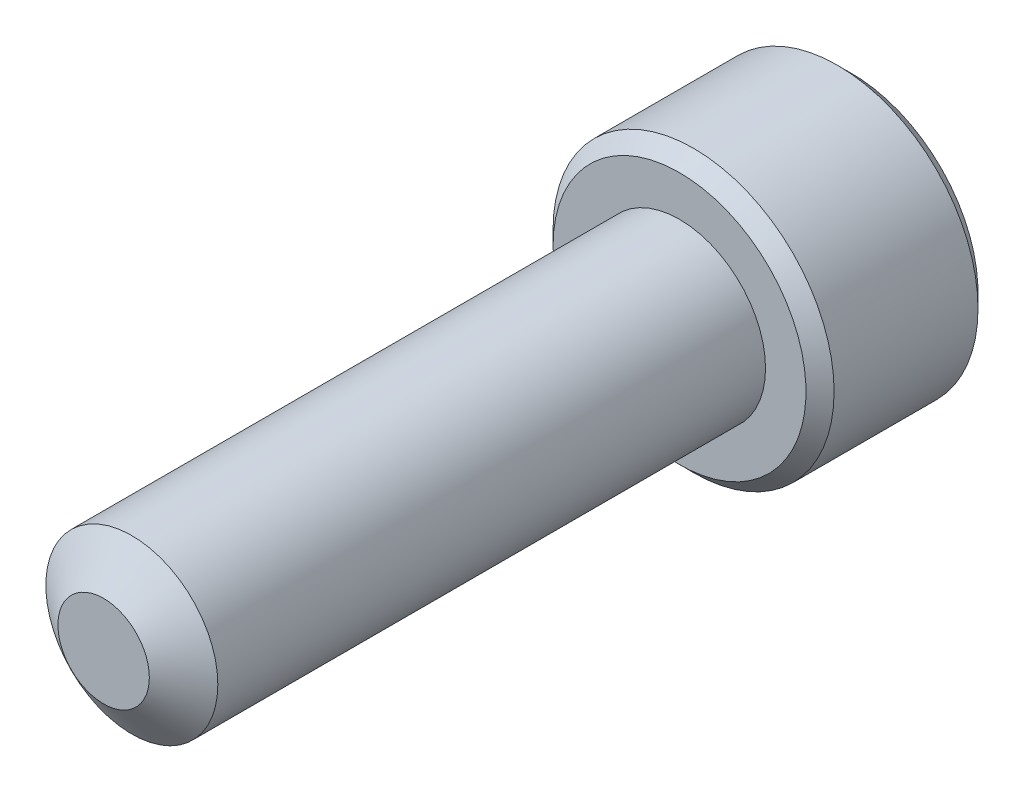
ISO-10303-21;
HEADER;
FILE_DESCRIPTION(('STEP AP214'),'2;1');
FILE_NAME('part.step','',(''),(''),'','','');
FILE_SCHEMA(('AUTOMOTIVE_DESIGN { 1 0 10303 214 1 1 1 1 }'));
ENDSEC;
DATA;
#1=APPLICATION_CONTEXT('core data for automotive mechanical design processes');
#2=APPLICATION_PROTOCOL_DEFINITION('international standard','automotive_design',2000,#1);
#3=PRODUCT_CONTEXT('',#1,'mechanical');
#4=PRODUCT('Part','Part','',(#3));
#5=PRODUCT_RELATED_PRODUCT_CATEGORY('part','',(#4));
#6=PRODUCT_DEFINITION_FORMATION('','',#4);
#7=PRODUCT_DEFINITION_CONTEXT('part definition',#1,'design');
#8=PRODUCT_DEFINITION('design','',#6,#7);
#9=PRODUCT_DEFINITION_SHAPE('','',#8);
#10=(LENGTH_UNIT() NAMED_UNIT(*) SI_UNIT(.MILLI.,.METRE.));
#11=(NAMED_UNIT(*) PLANE_ANGLE_UNIT() SI_UNIT($,.RADIAN.));
#12=(NAMED_UNIT(*) SI_UNIT($,.STERADIAN.) SOLID_ANGLE_UNIT());
#13=UNCERTAINTY_MEASURE_WITH_UNIT(LENGTH_MEASURE(1.E-05),#10,'distance_accuracy_value','');
#14=(GEOMETRIC_REPRESENTATION_CONTEXT(3) GLOBAL_UNCERTAINTY_ASSIGNED_CONTEXT((#13)) GLOBAL_UNIT_ASSIGNED_CONTEXT((#10,
#11,#12)) REPRESENTATION_CONTEXT('',''));
#15=CARTESIAN_POINT('',(0.,0.,0.));
#16=DIRECTION('',(0.,0.,1.));
#17=DIRECTION('',(1.,0.,0.));
#18=AXIS2_PLACEMENT_3D('',#15,#16,#17);
#19=CARTESIAN_POINT('',(0.,0.,-9.52499999999981));
#20=DIRECTION('',(0.,0.,1.));
#21=DIRECTION('',(1.,0.,0.));
#22=AXIS2_PLACEMENT_3D('',#19,#20,#21);
#23=CYLINDRICAL_SURFACE('',#22,1.4224);
#24=CARTESIAN_POINT('',(0.,0.,-9.52499999999981));
#25=DIRECTION('',(0.,0.,-1.));
#26=DIRECTION('',(-1.,0.,0.));
#27=AXIS2_PLACEMENT_3D('',#24,#25,#26);
#28=CIRCLE('',#27,1.4224);
#29=CARTESIAN_POINT('',(-1.42239999999996,0.,-9.52499999999982));
#30=VERTEX_POINT('',#29);
#31=EDGE_CURVE('E215',#30,#30,#28,.F.);
#32=ORIENTED_EDGE('',*,*,#31,.T.);
#33=EDGE_LOOP('',(#32));
#34=FACE_BOUND('',#33,.T.);
#35=CARTESIAN_POINT('',(0.,0.,-0.466649531705332));
#36=DIRECTION('',(0.,0.,1.));
#37=DIRECTION('',(1.,0.,0.));
#38=AXIS2_PLACEMENT_3D('',#35,#36,#37);
#39=CIRCLE('',#38,1.4224);
#40=CARTESIAN_POINT('',(1.4224,0.,-0.466649531705329));
#41=VERTEX_POINT('',#40);
#42=EDGE_CURVE('E112',#41,#41,#39,.T.);
#43=ORIENTED_EDGE('',*,*,#42,.F.);
#44=EDGE_LOOP('',(#43));
#45=FACE_BOUND('',#44,.T.);
#46=ADVANCED_FACE('F38',(#34,#45),#23,.T.);
#47=CARTESIAN_POINT('',(0.,0.,0.));
#48=DIRECTION('',(0.,0.,-1.));
#49=DIRECTION('',(-1.,0.,0.));
#50=AXIS2_PLACEMENT_3D('',#47,#48,#49);
#51=CONICAL_SURFACE('',#50,0.755955401447659,0.959931088596884);
#52=ORIENTED_EDGE('',*,*,#42,.T.);
#53=EDGE_LOOP('',(#52));
#54=FACE_BOUND('',#53,.T.);
#55=CARTESIAN_POINT('',(0.,0.,0.));
#56=DIRECTION('',(0.,0.,1.));
#57=DIRECTION('',(1.,0.,0.));
#58=AXIS2_PLACEMENT_3D('',#55,#56,#57);
#59=CIRCLE('',#58,0.755955401447659);
#60=CARTESIAN_POINT('',(0.755955401447661,0.,0.));
#61=VERTEX_POINT('',#60);
#62=EDGE_CURVE('E213',#61,#61,#59,.T.);
#63=ORIENTED_EDGE('',*,*,#62,.F.);
#64=EDGE_LOOP('',(#63));
#65=FACE_BOUND('',#64,.T.);
#66=ADVANCED_FACE('F196',(#54,#65),#51,.T.);
#67=CARTESIAN_POINT('',(0.,0.,0.));
#68=DIRECTION('',(0.,0.,1.));
#69=DIRECTION('',(1.,0.,0.));
#70=AXIS2_PLACEMENT_3D('',#67,#68,#69);
#71=PLANE('',#70);
#72=ORIENTED_EDGE('',*,*,#62,.T.);
#73=EDGE_LOOP('',(#72));
#74=FACE_BOUND('',#73,.T.);
#75=ADVANCED_FACE('F193',(#74),#71,.T.);
#76=CARTESIAN_POINT('',(0.,0.,-12.3697999999998));
#77=DIRECTION('',(0.,0.,1.));
#78=DIRECTION('',(1.,0.,0.));
#79=AXIS2_PLACEMENT_3D('',#76,#77,#78);
#80=CYLINDRICAL_SURFACE('',#79,2.3241);
#81=CARTESIAN_POINT('',(0.,1.00613961606655E-13,-12.1373899999998));
#82=DIRECTION('',(0.,0.,-1.));
#83=DIRECTION('',(-1.,0.,0.));
#84=AXIS2_PLACEMENT_3D('',#81,#82,#83);
#85=CIRCLE('',#84,2.3241);
#86=CARTESIAN_POINT('',(-2.32410000000002,1.01710576072556E-13,-12.1373899999998));
#87=VERTEX_POINT('',#86);
#88=EDGE_CURVE('E46',#87,#87,#85,.F.);
#89=ORIENTED_EDGE('',*,*,#88,.T.);
#90=EDGE_LOOP('',(#89));
#91=FACE_BOUND('',#90,.T.);
#92=CARTESIAN_POINT('',(0.,0.,-9.75740999999985));
#93=DIRECTION('',(0.,0.,-1.));
#94=DIRECTION('',(-1.,0.,0.));
#95=AXIS2_PLACEMENT_3D('',#92,#93,#94);
#96=CIRCLE('',#95,2.3241);
#97=CARTESIAN_POINT('',(-2.32409999999998,0.,-9.75740999999986));
#98=VERTEX_POINT('',#97);
#99=EDGE_CURVE('E172',#98,#98,#96,.T.);
#100=ORIENTED_EDGE('',*,*,#99,.T.);
#101=EDGE_LOOP('',(#100));
#102=FACE_BOUND('',#101,.T.);
#103=ADVANCED_FACE('F177',(#91,#102),#80,.T.);
#104=CARTESIAN_POINT('',(0.,0.,-12.3697999999998));
#105=DIRECTION('',(0.,0.,-1.));
#106=DIRECTION('',(-1.,0.,0.));
#107=AXIS2_PLACEMENT_3D('',#104,#105,#106);
#108=PLANE('',#107);
#109=CARTESIAN_POINT('',(0.,0.,-12.3697999999998));
#110=DIRECTION('',(0.,0.,-1.));
#111=DIRECTION('',(-1.,0.,0.));
#112=AXIS2_PLACEMENT_3D('',#109,#110,#111);
#113=CIRCLE('',#112,2.09169);
#114=CARTESIAN_POINT('',(-2.09168999999995,0.,-12.3697999999998));
#115=VERTEX_POINT('',#114);
#116=EDGE_CURVE('E111',#115,#115,#113,.T.);
#117=ORIENTED_EDGE('',*,*,#116,.T.);
#118=EDGE_LOOP('',(#117));
#119=FACE_BOUND('',#118,.T.);
#120=CARTESIAN_POINT('',(0.,0.,-12.3697999999998));
#121=DIRECTION('',(0.,0.,-1.));
#122=DIRECTION('',(-1.,0.,0.));
#123=AXIS2_PLACEMENT_3D('',#120,#121,#122);
#124=CIRCLE('',#123,1.3748153285078);
#125=CARTESIAN_POINT('',(-1.19062500000001,0.687407664253941,-12.3697999999998));
#126=VERTEX_POINT('',#125);
#127=CARTESIAN_POINT('',(0.,1.37481532850783,-12.3697999999998));
#128=VERTEX_POINT('',#127);
#129=EDGE_CURVE('E92',#126,#128,#124,.T.);
#130=ORIENTED_EDGE('',*,*,#129,.F.);
#131=CARTESIAN_POINT('',(-1.19062500000002,-0.687407664253851,-12.3697999999998));
#132=VERTEX_POINT('',#131);
#133=EDGE_CURVE('E52',#132,#126,#124,.T.);
#134=ORIENTED_EDGE('',*,*,#133,.F.);
#135=CARTESIAN_POINT('',(0.,-1.37481532850773,-12.3697999999998));
#136=VERTEX_POINT('',#135);
#137=EDGE_CURVE('E271',#136,#132,#124,.T.);
#138=ORIENTED_EDGE('',*,*,#137,.F.);
#139=CARTESIAN_POINT('',(1.19062499999993,-0.687407664253795,-12.3697999999999));
#140=VERTEX_POINT('',#139);
#141=EDGE_CURVE('E59',#140,#136,#124,.T.);
#142=ORIENTED_EDGE('',*,*,#141,.F.);
#143=CARTESIAN_POINT('',(1.19062499999994,0.687407664253983,-12.3697999999998));
#144=VERTEX_POINT('',#143);
#145=EDGE_CURVE('E133',#144,#140,#124,.T.);
#146=ORIENTED_EDGE('',*,*,#145,.F.);
#147=EDGE_CURVE('E101',#128,#144,#124,.T.);
#148=ORIENTED_EDGE('',*,*,#147,.F.);
#149=EDGE_LOOP('',(#130,#134,#138,#142,#146,#148));
#150=FACE_BOUND('',#149,.T.);
#151=ADVANCED_FACE('F132',(#119,#150),#108,.T.);
#152=CARTESIAN_POINT('',(0.,0.,-9.52499999999981));
#153=DIRECTION('',(0.,0.,-1.));
#154=DIRECTION('',(-1.,0.,0.));
#155=AXIS2_PLACEMENT_3D('',#152,#153,#154);
#156=PLANE('',#155);
#157=CARTESIAN_POINT('',(0.,0.,-9.52499999999981));
#158=DIRECTION('',(0.,0.,-1.));
#159=DIRECTION('',(-1.,0.,0.));
#160=AXIS2_PLACEMENT_3D('',#157,#158,#159);
#161=CIRCLE('',#160,2.09169);
#162=CARTESIAN_POINT('',(-2.09168999999996,0.,-9.52499999999982));
#163=VERTEX_POINT('',#162);
#164=EDGE_CURVE('E11',#163,#163,#161,.F.);
#165=ORIENTED_EDGE('',*,*,#164,.T.);
#166=EDGE_LOOP('',(#165));
#167=FACE_BOUND('',#166,.T.);
#168=ORIENTED_EDGE('',*,*,#31,.F.);
#169=EDGE_LOOP('',(#168));
#170=FACE_BOUND('',#169,.T.);
#171=ADVANCED_FACE('F186',(#167,#170),#156,.F.);
#172=CARTESIAN_POINT('',(0.,0.,-12.3697999999998));
#173=DIRECTION('',(0.,0.,-1.));
#174=DIRECTION('',(-1.,0.,0.));
#175=AXIS2_PLACEMENT_3D('',#172,#173,#174);
#176=CONICAL_SURFACE('',#175,1.3748153285078,0.78539816339745);
#177=ORIENTED_EDGE('',*,*,#147,.T.);
#178=CARTESIAN_POINT('',(-0.000199999999967587,1.3749307985617,-12.3699154845999));
#179=CARTESIAN_POINT('',(0.0407344195898851,1.3512973003924,-12.3462987642141));
#180=CARTESIAN_POINT('',(0.0823533883019986,1.32726857760308,-12.324068781723));
#181=CARTESIAN_POINT('',(0.167219443673659,1.27827113768919,-12.2833656626273));
#182=CARTESIAN_POINT('',(0.210474607290993,1.25329775733088,-12.2649151826474));
#183=CARTESIAN_POINT('',(0.297696647457468,1.2029400889615,-12.2333088380042));
#184=CARTESIAN_POINT('',(0.341641294957975,1.17756863489764,-12.2200735042432));
#185=CARTESIAN_POINT('',(0.430498374163732,1.12626697629878,-12.1996814515752));
#186=CARTESIAN_POINT('',(0.475408088834776,1.10033834044421,-12.1925095028957));
#187=CARTESIAN_POINT('',(0.552804127656995,1.055653716596,-12.1860385386486));
#188=CARTESIAN_POINT('',(0.585190412515669,1.0369554863148,-12.1850803201466));
#189=CARTESIAN_POINT('',(0.649906073317797,0.999591882129916,-12.1866926490719));
#190=CARTESIAN_POINT('',(0.6822354351273,0.980926516386467,-12.1892639751794));
#191=CARTESIAN_POINT('',(0.746582156071515,0.943775919727857,-12.1977867539934));
#192=CARTESIAN_POINT('',(0.778599196336801,0.925290872912045,-12.2037413547524));
#193=CARTESIAN_POINT('',(0.84209876339649,0.888629380776694,-12.218709964071));
#194=CARTESIAN_POINT('',(0.873581054644194,0.870453071450105,-12.2277252859118));
#195=CARTESIAN_POINT('',(0.954214838572157,0.823899134593503,-12.2544822958378));
#196=CARTESIAN_POINT('',(1.0028578352677,0.795815087357172,-12.2742368144358));
#197=CARTESIAN_POINT('',(1.09823941635216,0.740746505842354,-12.3187367689575));
#198=CARTESIAN_POINT('',(1.14498361758718,0.713758728676255,-12.343465964716));
#199=CARTESIAN_POINT('',(1.19082499999999,0.687292194200124,-12.3699154845999));
#200=B_SPLINE_CURVE_WITH_KNOTS('',3,(#178,#179,#180,#181,#182,#183,#184,#185,#186,#187,#188,
#189,#190,#191,#192,#193,#194,#195,#196,#197,#198,#199),.UNSPECIFIED.,.F.,.F.,(4,2,2,2,2,2,2,2,
2,2,4),(0.,0.158625672934115,0.31817607984329,0.475191357500681,0.631811068630764,
0.743878551794729,0.855970763007046,0.968167444423263,1.08041232768379,1.2587335164547,
1.4364817447985),.UNSPECIFIED.);
#201=EDGE_CURVE('E106',#128,#144,#200,.T.);
#202=ORIENTED_EDGE('',*,*,#201,.F.);
#203=EDGE_LOOP('',(#177,#202));
#204=FACE_BOUND('',#203,.T.);
#205=ADVANCED_FACE('F107',(#204),#176,.F.);
#206=ORIENTED_EDGE('',*,*,#145,.T.);
#207=CARTESIAN_POINT('',(1.19062500000002,-1.3709714529469,-12.8107904472898));
#208=CARTESIAN_POINT('',(1.19062500000002,-1.33758920637889,-12.7855899888077));
#209=CARTESIAN_POINT('',(1.19062500000002,-1.30402095496658,-12.7606366202373));
#210=CARTESIAN_POINT('',(1.19062500000002,-1.23643692297762,-12.711326087177));
#211=CARTESIAN_POINT('',(1.19062500000002,-1.20242103219112,-12.6869690738992));
#212=CARTESIAN_POINT('',(1.19062500000002,-1.09909081482553,-12.614598208989));
#213=CARTESIAN_POINT('',(1.19062500000001,-1.02900143506765,-12.5676726225954));
#214=CARTESIAN_POINT('',(1.19062500000002,-0.882026737424197,-12.4755521033254));
#215=CARTESIAN_POINT('',(1.19062500000003,-0.804981866019942,-12.4306088372418));
#216=CARTESIAN_POINT('',(1.190625,-0.647043893307907,-12.3483980245066));
#217=CARTESIAN_POINT('',(1.19062499999995,-0.56616494370285,-12.3111046017319));
#218=CARTESIAN_POINT('',(1.19062499999998,-0.444764933868778,-12.2654795555629));
#219=CARTESIAN_POINT('',(1.19062500000001,-0.406041211486637,-12.2523848390212));
#220=CARTESIAN_POINT('',(1.19062500000003,-0.327658904711858,-12.2293042758964));
#221=CARTESIAN_POINT('',(1.19062500000002,-0.288000256118176,-12.2193186434857));
#222=CARTESIAN_POINT('',(1.19062500000001,-0.208647693212021,-12.203141229065));
#223=CARTESIAN_POINT('',(1.19062500000002,-0.168967240621886,-12.1968844458487));
#224=CARTESIAN_POINT('',(1.19062500000002,-0.0891819742964573,-12.1882868884183));
#225=CARTESIAN_POINT('',(1.19062500000001,-0.0490772347012353,-12.1859454410497));
#226=CARTESIAN_POINT('',(1.19062500000001,0.0297075773932525,-12.1853522440674));
#227=CARTESIAN_POINT('',(1.19062500000002,0.0683866068288826,-12.1869553537958));
#228=CARTESIAN_POINT('',(1.19062500000002,0.145416876633219,-12.1938430277443));
#229=CARTESIAN_POINT('',(1.19062500000001,0.183768052740744,-12.1991282976682));
#230=CARTESIAN_POINT('',(1.19062500000002,0.260508634905004,-12.2131814122326));
#231=CARTESIAN_POINT('',(1.19062500000002,0.298887052039189,-12.2220083626056));
#232=CARTESIAN_POINT('',(1.19062500000001,0.374805334250713,-12.2426757099804));
#233=CARTESIAN_POINT('',(1.19062499999999,0.412345269207138,-12.2545158548357));
#234=CARTESIAN_POINT('',(1.19062499999996,0.530535580908892,-12.296247333667));
#235=CARTESIAN_POINT('',(1.190625,0.609503725744518,-12.3308913969141));
#236=CARTESIAN_POINT('',(1.19062500000003,0.763730269113565,-12.4079182519746));
#237=CARTESIAN_POINT('',(1.19062500000002,0.838974064674713,-12.4503288466685));
#238=CARTESIAN_POINT('',(1.19062500000001,0.982775796189741,-12.5378256450248));
#239=CARTESIAN_POINT('',(1.19062500000002,1.05148016607057,-12.5826741620551));
#240=CARTESIAN_POINT('',(1.19062500000002,1.15270222256268,-12.6520053299224));
#241=CARTESIAN_POINT('',(1.19062500000002,1.18600604145849,-12.675360176337));
#242=CARTESIAN_POINT('',(1.19062500000002,1.25215860362247,-12.7226875690192));
#243=CARTESIAN_POINT('',(1.19062500000001,1.28500746868294,-12.7466599448581));
#244=CARTESIAN_POINT('',(1.19062500000001,1.31766689427988,-12.7708883667711));
#245=B_SPLINE_CURVE_WITH_KNOTS('',3,(#207,#208,#209,#210,#211,#212,#213,#214,#215,#216,#217,
#218,#219,#220,#221,#222,#223,#224,#225,#226,#227,#228,#229,#230,#231,#232,#233,#234,#235,#236,
#237,#238,#239,#240,#241,#242,#243,#244),.UNSPECIFIED.,.F.,.F.,(4,2,2,2,2,2,2,2,2,2,2,2,2,2,2,2,
2,2,4),(0.,0.125475644763345,0.250982782413998,0.50391251876923,0.771279184643307,
1.03772598255668,1.16025581644641,1.28279408906677,1.40312855503258,1.52344233005041,
1.63939577664887,1.75537145240487,1.87336894094847,1.99135655861161,2.24929724983461,
2.50818004711579,2.75419821472216,2.87622362118618,2.99821570388985),.UNSPECIFIED.);
#246=EDGE_CURVE('E100',#144,#140,#245,.F.);
#247=ORIENTED_EDGE('',*,*,#246,.F.);
#248=EDGE_LOOP('',(#206,#247));
#249=FACE_BOUND('',#248,.T.);
#250=ADVANCED_FACE('F277',(#249),#176,.F.);
#251=ORIENTED_EDGE('',*,*,#141,.T.);
#252=CARTESIAN_POINT('',(1.19082500000002,-0.687292194200075,-12.3699154845999));
#253=CARTESIAN_POINT('',(1.14989058041017,-0.710925692369388,-12.3462987642141));
#254=CARTESIAN_POINT('',(1.10827161169805,-0.734954415158717,-12.3240687817229));
#255=CARTESIAN_POINT('',(1.02340555632639,-0.783951855072601,-12.2833656626272));
#256=CARTESIAN_POINT('',(0.980150392709058,-0.808925235430908,-12.2649151826474));
#257=CARTESIAN_POINT('',(0.892928352542597,-0.859282903800289,-12.2333088380041));
#258=CARTESIAN_POINT('',(0.848983705042101,-0.88465435786415,-12.2200735042431));
#259=CARTESIAN_POINT('',(0.760126625836331,-0.935956016462986,-12.1996814515752));
#260=CARTESIAN_POINT('',(0.715216911165263,-0.96188465231753,-12.1925095028958));
#261=CARTESIAN_POINT('',(0.637820872343051,-1.00656927616575,-12.1860385386487));
#262=CARTESIAN_POINT('',(0.605434587484394,-1.02526750644697,-12.1850803201466));
#263=CARTESIAN_POINT('',(0.540718926682282,-1.06263111063187,-12.1866926490719));
#264=CARTESIAN_POINT('',(0.508389564872778,-1.08129647637531,-12.1892639751794));
#265=CARTESIAN_POINT('',(0.444042843928573,-1.11844707303392,-12.1977867539934));
#266=CARTESIAN_POINT('',(0.412025803663297,-1.13693211984974,-12.2037413547524));
#267=CARTESIAN_POINT('',(0.348526236603599,-1.17359361198505,-12.218709964071));
#268=CARTESIAN_POINT('',(0.317043945355875,-1.19176992131159,-12.2277252859119));
#269=CARTESIAN_POINT('',(0.236410161427891,-1.23832385816815,-12.2544822958379));
#270=CARTESIAN_POINT('',(0.187767164732376,-1.26640790540456,-12.2742368144358));
#271=CARTESIAN_POINT('',(0.0923855836479209,-1.32147648691947,-12.3187367689575));
#272=CARTESIAN_POINT('',(0.0456413824128745,-1.34846426408558,-12.343465964716));
#273=CARTESIAN_POINT('',(-0.000200000000040446,-1.37493079856156,-12.3699154845999));
#274=B_SPLINE_CURVE_WITH_KNOTS('',3,(#252,#253,#254,#255,#256,#257,#258,#259,#260,#261,#262,
#263,#264,#265,#266,#267,#268,#269,#270,#271,#272,#273),.UNSPECIFIED.,.F.,.F.,(4,2,2,2,2,2,2,2,
2,2,4),(0.,0.158625672934123,0.318176079843278,0.475191357500652,0.631811068630733,
0.743878551794691,0.855970763006993,0.968167444423198,1.08041232768372,1.25873351645465,
1.43648174479848),.UNSPECIFIED.);
#275=EDGE_CURVE('E142',#140,#136,#274,.T.);
#276=ORIENTED_EDGE('',*,*,#275,.F.);
#277=EDGE_LOOP('',(#251,#276));
#278=FACE_BOUND('',#277,.T.);
#279=ADVANCED_FACE('F274',(#278),#176,.F.);
#280=ORIENTED_EDGE('',*,*,#137,.T.);
#281=CARTESIAN_POINT('',(0.000200000000033507,-1.37493079856163,-12.3699154845998));
#282=CARTESIAN_POINT('',(-0.0407344195898303,-1.35129730039227,-12.346298764214));
#283=CARTESIAN_POINT('',(-0.0823533883019515,-1.32726857760292,-12.3240687817229));
#284=CARTESIAN_POINT('',(-0.167219443673612,-1.27827113768902,-12.2833656626272));
#285=CARTESIAN_POINT('',(-0.210474607290939,-1.25329775733072,-12.2649151826474));
#286=CARTESIAN_POINT('',(-0.297696647457401,-1.20294008896135,-12.2333088380041));
#287=CARTESIAN_POINT('',(-0.341641294957902,-1.1775686348975,-12.2200735042431));
#288=CARTESIAN_POINT('',(-0.430498374163666,-1.12626697629863,-12.1996814515752));
#289=CARTESIAN_POINT('',(-0.475408088834722,-1.10033834044405,-12.1925095028958));
#290=CARTESIAN_POINT('',(-0.552804127656953,-1.05565371659583,-12.1860385386487));
#291=CARTESIAN_POINT('',(-0.58519041251563,-1.03695548631463,-12.1850803201466));
#292=CARTESIAN_POINT('',(-0.649906073317762,-0.999591882129751,-12.1866926490719));
#293=CARTESIAN_POINT('',(-0.682235435127264,-0.980926516386304,-12.1892639751794));
#294=CARTESIAN_POINT('',(-0.746582156071478,-0.943775919727684,-12.1977867539934));
#295=CARTESIAN_POINT('',(-0.778599196336762,-0.925290872911859,-12.2037413547524));
#296=CARTESIAN_POINT('',(-0.84209876339646,-0.888629380776543,-12.218709964071));
#297=CARTESIAN_POINT('',(-0.873581054644176,-0.870453071450002,-12.2277252859119));
#298=CARTESIAN_POINT('',(-0.954214838572143,-0.823899134593437,-12.2544822958379));
#299=CARTESIAN_POINT('',(-1.00285783526767,-0.795815087357041,-12.2742368144359));
#300=CARTESIAN_POINT('',(-1.09823941635211,-0.74074650584215,-12.3187367689575));
#301=CARTESIAN_POINT('',(-1.14498361758714,-0.713758728676043,-12.3434659647159));
#302=CARTESIAN_POINT('',(-1.19082499999999,-0.687292194200048,-12.3699154845999));
#303=B_SPLINE_CURVE_WITH_KNOTS('',3,(#281,#282,#283,#284,#285,#286,#287,#288,#289,#290,#291,
#292,#293,#294,#295,#296,#297,#298,#299,#300,#301,#302),.UNSPECIFIED.,.F.,.F.,(4,2,2,2,2,2,2,2,
2,2,4),(0.,0.158625672934127,0.318176079843274,0.475191357500654,0.631811068630749,
0.74387855179473,0.855970763007045,0.968167444423265,1.0804123276838,1.25873351645469,
1.43648174479848),.UNSPECIFIED.);
#304=EDGE_CURVE('E249',#136,#132,#303,.T.);
#305=ORIENTED_EDGE('',*,*,#304,.F.);
#306=EDGE_LOOP('',(#280,#305));
#307=FACE_BOUND('',#306,.T.);
#308=ADVANCED_FACE('F273',(#307),#176,.F.);
#309=ORIENTED_EDGE('',*,*,#133,.T.);
#310=CARTESIAN_POINT('',(-1.19062499999993,-1.37097145294683,-12.8107904472897));
#311=CARTESIAN_POINT('',(-1.19062499999998,-1.3375892063788,-12.7855899888076));
#312=CARTESIAN_POINT('',(-1.190625,-1.30402095496649,-12.7606366202373));
#313=CARTESIAN_POINT('',(-1.19062500000002,-1.23643692297753,-12.711326087177));
#314=CARTESIAN_POINT('',(-1.19062500000001,-1.20242103219104,-12.6869690738992));
#315=CARTESIAN_POINT('',(-1.19062500000001,-1.09909081482546,-12.614598208989));
#316=CARTESIAN_POINT('',(-1.19062500000002,-1.02900143506759,-12.5676726225954));
#317=CARTESIAN_POINT('',(-1.19062500000001,-0.882026737424146,-12.4755521033255));
#318=CARTESIAN_POINT('',(-1.19062499999999,-0.80498186601989,-12.4306088372419));
#319=CARTESIAN_POINT('',(-1.19062500000003,-0.647043893307889,-12.3483980245067));
#320=CARTESIAN_POINT('',(-1.19062500000009,-0.566164943702867,-12.3111046017319));
#321=CARTESIAN_POINT('',(-1.19062500000005,-0.4447649338688,-12.2654795555629));
#322=CARTESIAN_POINT('',(-1.19062500000002,-0.406041211486654,-12.2523848390213));
#323=CARTESIAN_POINT('',(-1.190625,-0.327658904711876,-12.2293042758965));
#324=CARTESIAN_POINT('',(-1.19062500000001,-0.288000256118202,-12.2193186434858));
#325=CARTESIAN_POINT('',(-1.19062500000002,-0.208647693212057,-12.2031412290651));
#326=CARTESIAN_POINT('',(-1.19062500000002,-0.168967240621925,-12.1968844458488));
#327=CARTESIAN_POINT('',(-1.19062500000001,-0.0891819742965089,-12.1882868884184));
#328=CARTESIAN_POINT('',(-1.19062499999999,-0.0490772347012962,-12.1859454410497));
#329=CARTESIAN_POINT('',(-1.19062499999999,0.0297075773931898,-12.1853522440675));
#330=CARTESIAN_POINT('',(-1.19062500000001,0.0683866068288271,-12.1869553537959));
#331=CARTESIAN_POINT('',(-1.19062500000002,0.145416876633182,-12.1938430277444));
#332=CARTESIAN_POINT('',(-1.19062500000001,0.183768052740718,-12.1991282976683));
#333=CARTESIAN_POINT('',(-1.19062500000001,0.260508634904999,-12.2131814122327));
#334=CARTESIAN_POINT('',(-1.19062500000002,0.298887052039196,-12.2220083626057));
#335=CARTESIAN_POINT('',(-1.19062500000001,0.374805334250742,-12.2426757099805));
#336=CARTESIAN_POINT('',(-1.19062499999999,0.412345269207177,-12.2545158548358));
#337=CARTESIAN_POINT('',(-1.19062499999997,0.530535580908929,-12.2962473336671));
#338=CARTESIAN_POINT('',(-1.190625,0.609503725744544,-12.3308913969142));
#339=CARTESIAN_POINT('',(-1.19062500000002,0.763730269113573,-12.4079182519747));
#340=CARTESIAN_POINT('',(-1.19062500000001,0.838974064674713,-12.4503288466685));
#341=CARTESIAN_POINT('',(-1.19062500000001,0.982775796189725,-12.5378256450248));
#342=CARTESIAN_POINT('',(-1.19062500000001,1.05148016607055,-12.5826741620551));
#343=CARTESIAN_POINT('',(-1.19062500000001,1.15270222256263,-12.6520053299225));
#344=CARTESIAN_POINT('',(-1.19062500000002,1.18600604145844,-12.675360176337));
#345=CARTESIAN_POINT('',(-1.190625,1.25215860362241,-12.7226875690192));
#346=CARTESIAN_POINT('',(-1.19062499999999,1.28500746868288,-12.7466599448581));
#347=CARTESIAN_POINT('',(-1.19062499999995,1.31766689427983,-12.7708883667711));
#348=B_SPLINE_CURVE_WITH_KNOTS('',3,(#310,#311,#312,#313,#314,#315,#316,#317,#318,#319,#320,
#321,#322,#323,#324,#325,#326,#327,#328,#329,#330,#331,#332,#333,#334,#335,#336,#337,#338,#339,
#340,#341,#342,#343,#344,#345,#346,#347),.UNSPECIFIED.,.F.,.F.,(4,2,2,2,2,2,2,2,2,2,2,2,2,2,2,2,
2,2,4),(0.,0.125475644763317,0.250982782413943,0.503912518769147,0.7712791846432,
1.03772598255653,1.16025581644624,1.28279408906659,1.40312855503239,1.5234423300502,
1.63939577664868,1.75537145240472,1.87336894094835,1.99135655861151,2.24929724983448,
2.50818004711564,2.75419821472196,2.87622362118596,2.99821570388959),.UNSPECIFIED.);
#349=EDGE_CURVE('E122',#132,#126,#348,.T.);
#350=ORIENTED_EDGE('',*,*,#349,.F.);
#351=EDGE_LOOP('',(#309,#350));
#352=FACE_BOUND('',#351,.T.);
#353=ADVANCED_FACE('F286',(#352),#176,.F.);
#354=ORIENTED_EDGE('',*,*,#129,.T.);
#355=CARTESIAN_POINT('',(-1.19082500000002,0.687292194200124,-12.3699154845999));
#356=CARTESIAN_POINT('',(-1.14989058041017,0.710925692369471,-12.3462987642141));
#357=CARTESIAN_POINT('',(-1.10827161169805,0.734954415158815,-12.324068781723));
#358=CARTESIAN_POINT('',(-1.0234055563264,0.783951855072704,-12.2833656626273));
#359=CARTESIAN_POINT('',(-0.980150392709079,0.808925235431002,-12.2649151826474));
#360=CARTESIAN_POINT('',(-0.892928352542621,0.859282903800379,-12.2333088380042));
#361=CARTESIAN_POINT('',(-0.84898370504212,0.884654357864244,-12.2200735042432));
#362=CARTESIAN_POINT('',(-0.760126625836325,0.935956016463094,-12.1996814515753));
#363=CARTESIAN_POINT('',(-0.715216911165238,0.961884652317648,-12.192509502896));
#364=CARTESIAN_POINT('',(-0.637820872343005,1.00656927616588,-12.1860385386488));
#365=CARTESIAN_POINT('',(-0.605434587484343,1.02526750644711,-12.1850803201467));
#366=CARTESIAN_POINT('',(-0.540718926682221,1.06263111063201,-12.1866926490719));
#367=CARTESIAN_POINT('',(-0.508389564872713,1.08129647637545,-12.1892639751794));
#368=CARTESIAN_POINT('',(-0.444042843928498,1.11844707303406,-12.1977867539935));
#369=CARTESIAN_POINT('',(-0.412025803663219,1.13693211984988,-12.2037413547524));
#370=CARTESIAN_POINT('',(-0.34852623660352,1.17359361198521,-12.2187099640711));
#371=CARTESIAN_POINT('',(-0.317043945355799,1.19176992131176,-12.2277252859119));
#372=CARTESIAN_POINT('',(-0.236410161427828,1.23832385816833,-12.2544822958378));
#373=CARTESIAN_POINT('',(-0.187767164732316,1.26640790540471,-12.2742368144358));
#374=CARTESIAN_POINT('',(-0.0923855836478826,1.32147648691958,-12.3187367689576));
#375=CARTESIAN_POINT('',(-0.0456413824128546,1.34846426408569,-12.3434659647161));
#376=CARTESIAN_POINT('',(0.00020000000001269,1.37493079856172,-12.3699154845999));
#377=B_SPLINE_CURVE_WITH_KNOTS('',3,(#355,#356,#357,#358,#359,#360,#361,#362,#363,#364,#365,
#366,#367,#368,#369,#370,#371,#372,#373,#374,#375,#376),.UNSPECIFIED.,.F.,.F.,(4,2,2,2,2,2,2,2,
2,2,4),(0.,0.158625672934117,0.318176079843243,0.475191357500647,0.631811068630768,
0.743878551794752,0.855970763007069,0.968167444423285,1.08041232768381,1.2587335164547,
1.43648174479851),.UNSPECIFIED.);
#378=EDGE_CURVE('E96',#126,#128,#377,.T.);
#379=ORIENTED_EDGE('',*,*,#378,.F.);
#380=EDGE_LOOP('',(#354,#379));
#381=FACE_BOUND('',#380,.T.);
#382=ADVANCED_FACE('F94',(#381),#176,.F.);
#383=CARTESIAN_POINT('',(1.19062500000001,2.06222299276174,-10.5838624999998));
#384=DIRECTION('',(0.,0.,-1.));
#385=DIRECTION('',(-1.,0.,0.));
#386=AXIS2_PLACEMENT_3D('',#383,#384,#385);
#387=PLANE('',#386);
#388=DIRECTION('',(0.866025403784441,0.500000000000001,0.));
#389=VECTOR('',#388,1.);
#390=CARTESIAN_POINT('',(-1.19062499999997,0.687407664254031,-10.5838624999998));
#391=LINE('',#390,#389);
#392=CARTESIAN_POINT('',(-1.19062499999997,0.687407664254031,-10.5838624999998));
#393=VERTEX_POINT('',#392);
#394=CARTESIAN_POINT('',(0.,1.37481532850791,-10.5838624999998));
#395=VERTEX_POINT('',#394);
#396=EDGE_CURVE('E121',#393,#395,#391,.T.);
#397=ORIENTED_EDGE('',*,*,#396,.T.);
#398=DIRECTION('',(0.86602540378444,-0.500000000000001,0.));
#399=VECTOR('',#398,1.);
#400=CARTESIAN_POINT('',(0.,1.37481532850791,-10.5838624999998));
#401=LINE('',#400,#399);
#402=CARTESIAN_POINT('',(1.19062500000001,0.687407664253983,-10.5838624999998));
#403=VERTEX_POINT('',#402);
#404=EDGE_CURVE('E126',#395,#403,#401,.T.);
#405=ORIENTED_EDGE('',*,*,#404,.T.);
#406=DIRECTION('',(0.,-1.,0.));
#407=VECTOR('',#406,1.);
#408=CARTESIAN_POINT('',(1.19062500000001,0.687407664253983,-10.5838624999998));
#409=LINE('',#408,#407);
#410=CARTESIAN_POINT('',(1.19062499999998,-0.687407664253913,-10.5838624999997));
#411=VERTEX_POINT('',#410);
#412=EDGE_CURVE('E237',#403,#411,#409,.T.);
#413=ORIENTED_EDGE('',*,*,#412,.T.);
#414=DIRECTION('',(-0.866025403784442,-0.500000000000001,0.));
#415=VECTOR('',#414,1.);
#416=CARTESIAN_POINT('',(1.19062499999998,-0.687407664253913,-10.5838624999997));
#417=LINE('',#416,#415);
#418=CARTESIAN_POINT('',(0.,-1.37481532850773,-10.5838624999998));
#419=VERTEX_POINT('',#418);
#420=EDGE_CURVE('E234',#411,#419,#417,.T.);
#421=ORIENTED_EDGE('',*,*,#420,.T.);
#422=DIRECTION('',(-0.866025403784441,0.500000000000001,0.));
#423=VECTOR('',#422,1.);
#424=CARTESIAN_POINT('',(0.,-1.37481532850773,-10.5838624999998));
#425=LINE('',#424,#423);
#426=CARTESIAN_POINT('',(-1.19062500000001,-0.68740766425383,-10.5838624999999));
#427=VERTEX_POINT('',#426);
#428=EDGE_CURVE('E231',#419,#427,#425,.T.);
#429=ORIENTED_EDGE('',*,*,#428,.T.);
#430=DIRECTION('',(0.,1.,0.));
#431=VECTOR('',#430,1.);
#432=CARTESIAN_POINT('',(-1.19062500000001,-0.68740766425383,-10.5838624999999));
#433=LINE('',#432,#431);
#434=EDGE_CURVE('E129',#427,#393,#433,.T.);
#435=ORIENTED_EDGE('',*,*,#434,.T.);
#436=EDGE_LOOP('',(#397,#405,#413,#421,#429,#435));
#437=FACE_BOUND('',#436,.T.);
#438=ADVANCED_FACE('F161',(#437),#387,.T.);
#439=CARTESIAN_POINT('',(0.,1.37481532850791,-10.5838624999998));
#440=DIRECTION('',(0.500000000000001,0.86602540378444,0.));
#441=DIRECTION('',(-0.866025403784441,0.5,0.));
#442=AXIS2_PLACEMENT_3D('',#439,#440,#441);
#443=PLANE('',#442);
#444=DIRECTION('',(0.,0.,-1.));
#445=VECTOR('',#444,1.);
#446=CARTESIAN_POINT('',(0.,1.37481532850791,-10.5838624999998));
#447=LINE('',#446,#445);
#448=EDGE_CURVE('E118',#395,#128,#447,.T.);
#449=ORIENTED_EDGE('',*,*,#448,.T.);
#450=ORIENTED_EDGE('',*,*,#201,.T.);
#451=DIRECTION('',(0.,0.,-1.));
#452=VECTOR('',#451,1.);
#453=CARTESIAN_POINT('',(1.19062500000001,0.687407664253983,-10.5838624999998));
#454=LINE('',#453,#452);
#455=EDGE_CURVE('E128',#403,#144,#454,.T.);
#456=ORIENTED_EDGE('',*,*,#455,.F.);
#457=ORIENTED_EDGE('',*,*,#404,.F.);
#458=EDGE_LOOP('',(#449,#450,#456,#457));
#459=FACE_BOUND('',#458,.T.);
#460=ADVANCED_FACE('F124',(#459),#443,.F.);
#461=CARTESIAN_POINT('',(1.19062500000001,0.687407664253983,-10.5838624999998));
#462=DIRECTION('',(1.,0.,0.));
#463=DIRECTION('',(0.,0.,-1.));
#464=AXIS2_PLACEMENT_3D('',#461,#462,#463);
#465=PLANE('',#464);
#466=ORIENTED_EDGE('',*,*,#455,.T.);
#467=ORIENTED_EDGE('',*,*,#246,.T.);
#468=DIRECTION('',(0.,0.,-1.));
#469=VECTOR('',#468,1.);
#470=CARTESIAN_POINT('',(1.19062499999998,-0.687407664253913,-10.5838624999997));
#471=LINE('',#470,#469);
#472=EDGE_CURVE('E220',#411,#140,#471,.T.);
#473=ORIENTED_EDGE('',*,*,#472,.F.);
#474=ORIENTED_EDGE('',*,*,#412,.F.);
#475=EDGE_LOOP('',(#466,#467,#473,#474));
#476=FACE_BOUND('',#475,.T.);
#477=ADVANCED_FACE('F150',(#476),#465,.F.);
#478=CARTESIAN_POINT('',(1.19062499999998,-0.687407664253913,-10.5838624999997));
#479=DIRECTION('',(0.500000000000001,-0.866025403784441,0.));
#480=DIRECTION('',(0.866025403784441,0.500000000000001,0.));
#481=AXIS2_PLACEMENT_3D('',#478,#479,#480);
#482=PLANE('',#481);
#483=ORIENTED_EDGE('',*,*,#472,.T.);
#484=ORIENTED_EDGE('',*,*,#275,.T.);
#485=DIRECTION('',(0.,0.,-1.));
#486=VECTOR('',#485,1.);
#487=CARTESIAN_POINT('',(0.,-1.37481532850773,-10.5838624999998));
#488=LINE('',#487,#486);
#489=EDGE_CURVE('E223',#419,#136,#488,.T.);
#490=ORIENTED_EDGE('',*,*,#489,.F.);
#491=ORIENTED_EDGE('',*,*,#420,.F.);
#492=EDGE_LOOP('',(#483,#484,#490,#491));
#493=FACE_BOUND('',#492,.T.);
#494=ADVANCED_FACE('F154',(#493),#482,.F.);
#495=CARTESIAN_POINT('',(0.,-1.37481532850773,-10.5838624999998));
#496=DIRECTION('',(-0.500000000000001,-0.866025403784441,0.));
#497=DIRECTION('',(0.86602540378444,-0.500000000000001,0.));
#498=AXIS2_PLACEMENT_3D('',#495,#496,#497);
#499=PLANE('',#498);
#500=ORIENTED_EDGE('',*,*,#489,.T.);
#501=ORIENTED_EDGE('',*,*,#304,.T.);
#502=DIRECTION('',(0.,0.,-1.));
#503=VECTOR('',#502,1.);
#504=CARTESIAN_POINT('',(-1.19062500000001,-0.68740766425383,-10.5838624999999));
#505=LINE('',#504,#503);
#506=EDGE_CURVE('E226',#427,#132,#505,.T.);
#507=ORIENTED_EDGE('',*,*,#506,.F.);
#508=ORIENTED_EDGE('',*,*,#428,.F.);
#509=EDGE_LOOP('',(#500,#501,#507,#508));
#510=FACE_BOUND('',#509,.T.);
#511=ADVANCED_FACE('F256',(#510),#499,.F.);
#512=CARTESIAN_POINT('',(-1.19062500000001,-0.68740766425383,-10.5838624999999));
#513=DIRECTION('',(-1.,0.,0.));
#514=DIRECTION('',(0.,0.,1.));
#515=AXIS2_PLACEMENT_3D('',#512,#513,#514);
#516=PLANE('',#515);
#517=ORIENTED_EDGE('',*,*,#506,.T.);
#518=ORIENTED_EDGE('',*,*,#349,.T.);
#519=DIRECTION('',(0.,0.,-1.));
#520=VECTOR('',#519,1.);
#521=CARTESIAN_POINT('',(-1.19062499999997,0.687407664254031,-10.5838624999998));
#522=LINE('',#521,#520);
#523=EDGE_CURVE('E120',#393,#126,#522,.T.);
#524=ORIENTED_EDGE('',*,*,#523,.F.);
#525=ORIENTED_EDGE('',*,*,#434,.F.);
#526=EDGE_LOOP('',(#517,#518,#524,#525));
#527=FACE_BOUND('',#526,.T.);
#528=ADVANCED_FACE('F253',(#527),#516,.F.);
#529=CARTESIAN_POINT('',(-1.19062499999997,0.687407664254031,-10.5838624999998));
#530=DIRECTION('',(-0.5,0.866025403784441,0.));
#531=DIRECTION('',(-0.866025403784442,-0.5,0.));
#532=AXIS2_PLACEMENT_3D('',#529,#530,#531);
#533=PLANE('',#532);
#534=ORIENTED_EDGE('',*,*,#523,.T.);
#535=ORIENTED_EDGE('',*,*,#378,.T.);
#536=ORIENTED_EDGE('',*,*,#448,.F.);
#537=ORIENTED_EDGE('',*,*,#396,.F.);
#538=EDGE_LOOP('',(#534,#535,#536,#537));
#539=FACE_BOUND('',#538,.T.);
#540=ADVANCED_FACE('F116',(#539),#533,.F.);
#541=CARTESIAN_POINT('',(0.,0.,-12.3697999999998));
#542=DIRECTION('',(0.,0.,1.));
#543=DIRECTION('',(1.,0.,0.));
#544=AXIS2_PLACEMENT_3D('',#541,#542,#543);
#545=CONICAL_SURFACE('',#544,2.09169,0.785398163397447);
#546=ORIENTED_EDGE('',*,*,#88,.F.);
#547=EDGE_LOOP('',(#546));
#548=FACE_BOUND('',#547,.T.);
#549=ORIENTED_EDGE('',*,*,#116,.F.);
#550=EDGE_LOOP('',(#549));
#551=FACE_BOUND('',#550,.T.);
#552=ADVANCED_FACE('F180',(#548,#551),#545,.T.);
#553=CARTESIAN_POINT('',(0.,0.,-9.75740999999985));
#554=DIRECTION('',(0.,0.,-1.));
#555=DIRECTION('',(-1.,0.,0.));
#556=AXIS2_PLACEMENT_3D('',#553,#554,#555);
#557=CONICAL_SURFACE('',#556,2.3241,0.785398163397447);
#558=ORIENTED_EDGE('',*,*,#164,.F.);
#559=EDGE_LOOP('',(#558));
#560=FACE_BOUND('',#559,.T.);
#561=ORIENTED_EDGE('',*,*,#99,.F.);
#562=EDGE_LOOP('',(#561));
#563=FACE_BOUND('',#562,.T.);
#564=ADVANCED_FACE('F40',(#560,#563),#557,.T.);
#565=CLOSED_SHELL('',(#46,#66,#75,#103,#151,#171,#205,#250,#279,#308,#353,#382,#438,#460,#477,
#494,#511,#528,#540,#552,#564));
#566=MANIFOLD_SOLID_BREP('B2',#565);
#567=ADVANCED_BREP_SHAPE_REPRESENTATION('',(#18,#566),#14);
#568=SHAPE_DEFINITION_REPRESENTATION(#9,#567);
ENDSEC;
END-ISO-10303-21;
